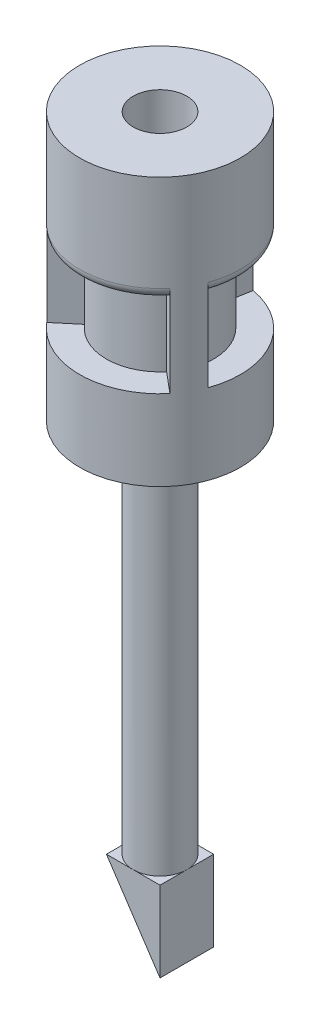
ISO-10303-21;
HEADER;
FILE_DESCRIPTION(('STEP AP214'),'2;1');
FILE_NAME('part.step','',(''),(''),'','','');
FILE_SCHEMA(('AUTOMOTIVE_DESIGN { 1 0 10303 214 1 1 1 1 }'));
ENDSEC;
DATA;
#1=APPLICATION_CONTEXT('core data for automotive mechanical design processes');
#2=APPLICATION_PROTOCOL_DEFINITION('international standard','automotive_design',2000,#1);
#3=PRODUCT_CONTEXT('',#1,'mechanical');
#4=PRODUCT('Part','Part','',(#3));
#5=PRODUCT_RELATED_PRODUCT_CATEGORY('part','',(#4));
#6=PRODUCT_DEFINITION_FORMATION('','',#4);
#7=PRODUCT_DEFINITION_CONTEXT('part definition',#1,'design');
#8=PRODUCT_DEFINITION('design','',#6,#7);
#9=PRODUCT_DEFINITION_SHAPE('','',#8);
#10=(LENGTH_UNIT() NAMED_UNIT(*) SI_UNIT(.MILLI.,.METRE.));
#11=(NAMED_UNIT(*) PLANE_ANGLE_UNIT() SI_UNIT($,.RADIAN.));
#12=(NAMED_UNIT(*) SI_UNIT($,.STERADIAN.) SOLID_ANGLE_UNIT());
#13=UNCERTAINTY_MEASURE_WITH_UNIT(LENGTH_MEASURE(1.E-05),#10,'distance_accuracy_value','');
#14=(GEOMETRIC_REPRESENTATION_CONTEXT(3) GLOBAL_UNCERTAINTY_ASSIGNED_CONTEXT((#13)) GLOBAL_UNIT_ASSIGNED_CONTEXT((#10,
#11,#12)) REPRESENTATION_CONTEXT('',''));
#15=CARTESIAN_POINT('',(0.,0.,0.));
#16=DIRECTION('',(0.,0.,1.));
#17=DIRECTION('',(1.,0.,0.));
#18=AXIS2_PLACEMENT_3D('',#15,#16,#17);
#19=CARTESIAN_POINT('',(10.,100.,0.));
#20=DIRECTION('',(0.,1.,0.));
#21=DIRECTION('',(0.,0.,1.));
#22=AXIS2_PLACEMENT_3D('',#19,#20,#21);
#23=PLANE('',#22);
#24=CARTESIAN_POINT('',(-5.,100.,0.));
#25=DIRECTION('',(0.,-1.,0.));
#26=DIRECTION('',(0.,0.,-1.));
#27=AXIS2_PLACEMENT_3D('',#24,#25,#26);
#28=CIRCLE('',#27,15.);
#29=CARTESIAN_POINT('',(-19.0953893117886,100.,5.13030214988503));
#30=VERTEX_POINT('',#29);
#31=CARTESIAN_POINT('',(-7.60472266500396,100.,-14.7721162951831));
#32=VERTEX_POINT('',#31);
#33=EDGE_CURVE('E193',#30,#32,#28,.T.);
#34=ORIENTED_EDGE('',*,*,#33,.F.);
#35=DIRECTION('',(-0.939692620785908,0.,0.342020143325669));
#36=VECTOR('',#35,1.);
#37=CARTESIAN_POINT('',(-12.0476946558945,100.,2.56515107494258));
#38=LINE('',#37,#36);
#39=CARTESIAN_POINT('',(-14.3969262078591,100.,3.42020143325669));
#40=VERTEX_POINT('',#39);
#41=EDGE_CURVE('E177',#40,#30,#38,.T.);
#42=ORIENTED_EDGE('',*,*,#41,.F.);
#43=CARTESIAN_POINT('',(-5.,100.,0.));
#44=DIRECTION('',(0.,-1.,0.));
#45=DIRECTION('',(0.,0.,-1.));
#46=AXIS2_PLACEMENT_3D('',#43,#44,#45);
#47=CIRCLE('',#46,10.);
#48=CARTESIAN_POINT('',(-6.73648177666931,100.,-9.84807753012208));
#49=VERTEX_POINT('',#48);
#50=EDGE_CURVE('E314',#40,#49,#47,.T.);
#51=ORIENTED_EDGE('',*,*,#50,.T.);
#52=DIRECTION('',(0.173648177666931,0.,0.984807753012208));
#53=VECTOR('',#52,1.);
#54=CARTESIAN_POINT('',(-6.30236133250201,100.,-7.38605814759173));
#55=LINE('',#54,#53);
#56=EDGE_CURVE('E346',#32,#49,#55,.T.);
#57=ORIENTED_EDGE('',*,*,#56,.F.);
#58=EDGE_LOOP('',(#34,#42,#51,#57));
#59=FACE_BOUND('',#58,.T.);
#60=ADVANCED_FACE('F33',(#59),#23,.T.);
#61=CARTESIAN_POINT('',(2.66044443118978,100.,6.4278760968654));
#62=VERTEX_POINT('',#61);
#63=CARTESIAN_POINT('',(-12.6604444311898,100.,6.4278760968654));
#64=VERTEX_POINT('',#63);
#65=EDGE_CURVE('E186',#62,#64,#47,.T.);
#66=ORIENTED_EDGE('',*,*,#65,.T.);
#67=DIRECTION('',(0.766044443118977,0.,-0.64278760968654));
#68=VECTOR('',#67,1.);
#69=CARTESIAN_POINT('',(-10.7453333233925,100.,4.82090707264917));
#70=LINE('',#69,#68);
#71=CARTESIAN_POINT('',(-16.4906666467847,100.,9.64181414529811));
#72=VERTEX_POINT('',#71);
#73=EDGE_CURVE('E170',#72,#64,#70,.T.);
#74=ORIENTED_EDGE('',*,*,#73,.F.);
#75=CARTESIAN_POINT('',(6.49066664678467,100.,9.6418141452981));
#76=VERTEX_POINT('',#75);
#77=EDGE_CURVE('E184',#76,#72,#28,.T.);
#78=ORIENTED_EDGE('',*,*,#77,.F.);
#79=DIRECTION('',(0.766044443118978,0.,0.64278760968654));
#80=VECTOR('',#79,1.);
#81=CARTESIAN_POINT('',(0.745333323392472,100.,4.82090707264916));
#82=LINE('',#81,#80);
#83=EDGE_CURVE('E331',#62,#76,#82,.T.);
#84=ORIENTED_EDGE('',*,*,#83,.F.);
#85=EDGE_LOOP('',(#66,#74,#78,#84));
#86=FACE_BOUND('',#85,.T.);
#87=ADVANCED_FACE('F182',(#86),#23,.T.);
#88=CARTESIAN_POINT('',(-5.,85.,0.));
#89=DIRECTION('',(0.,-1.,0.));
#90=DIRECTION('',(0.,0.,-1.));
#91=AXIS2_PLACEMENT_3D('',#88,#89,#90);
#92=CYLINDRICAL_SURFACE('',#91,10.);
#93=ORIENTED_EDGE('',*,*,#50,.F.);
#94=DIRECTION('',(0.,-1.,0.));
#95=VECTOR('',#94,1.);
#96=CARTESIAN_POINT('',(-14.3969262078591,85.,3.42020143325669));
#97=LINE('',#96,#95);
#98=CARTESIAN_POINT('',(-14.3969262078591,115.,3.42020143325669));
#99=VERTEX_POINT('',#98);
#100=EDGE_CURVE('E281',#99,#40,#97,.T.);
#101=ORIENTED_EDGE('',*,*,#100,.F.);
#102=CARTESIAN_POINT('',(-5.,115.,0.));
#103=DIRECTION('',(0.,-1.,0.));
#104=DIRECTION('',(0.,0.,-1.));
#105=AXIS2_PLACEMENT_3D('',#102,#103,#104);
#106=CIRCLE('',#105,10.);
#107=CARTESIAN_POINT('',(-6.7364817766693,115.,-9.84807753012208));
#108=VERTEX_POINT('',#107);
#109=EDGE_CURVE('E279',#99,#108,#106,.T.);
#110=ORIENTED_EDGE('',*,*,#109,.T.);
#111=DIRECTION('',(0.,-1.,0.));
#112=VECTOR('',#111,1.);
#113=CARTESIAN_POINT('',(-6.73648177666931,85.,-9.84807753012208));
#114=LINE('',#113,#112);
#115=EDGE_CURVE('E292',#49,#108,#114,.F.);
#116=ORIENTED_EDGE('',*,*,#115,.F.);
#117=EDGE_LOOP('',(#93,#101,#110,#116));
#118=FACE_BOUND('',#117,.T.);
#119=ADVANCED_FACE('F323',(#118),#92,.T.);
#120=CARTESIAN_POINT('',(2.66044443118978,115.,6.4278760968654));
#121=VERTEX_POINT('',#120);
#122=CARTESIAN_POINT('',(-12.6604444311898,115.,6.4278760968654));
#123=VERTEX_POINT('',#122);
#124=EDGE_CURVE('E315',#121,#123,#106,.T.);
#125=ORIENTED_EDGE('',*,*,#124,.T.);
#126=DIRECTION('',(0.,-1.,0.));
#127=VECTOR('',#126,1.);
#128=CARTESIAN_POINT('',(-12.6604444311898,85.,6.4278760968654));
#129=LINE('',#128,#127);
#130=EDGE_CURVE('E327',#64,#123,#129,.F.);
#131=ORIENTED_EDGE('',*,*,#130,.F.);
#132=ORIENTED_EDGE('',*,*,#65,.F.);
#133=DIRECTION('',(0.,-1.,0.));
#134=VECTOR('',#133,1.);
#135=CARTESIAN_POINT('',(2.66044443118978,85.,6.4278760968654));
#136=LINE('',#135,#134);
#137=EDGE_CURVE('E341',#121,#62,#136,.T.);
#138=ORIENTED_EDGE('',*,*,#137,.F.);
#139=EDGE_LOOP('',(#125,#131,#132,#138));
#140=FACE_BOUND('',#139,.T.);
#141=ADVANCED_FACE('F397',(#140),#92,.T.);
#142=CARTESIAN_POINT('',(10.,115.,0.));
#143=DIRECTION('',(0.,-1.,0.));
#144=DIRECTION('',(0.,0.,-1.));
#145=AXIS2_PLACEMENT_3D('',#142,#143,#144);
#146=PLANE('',#145);
#147=DIRECTION('',(0.939692620785909,0.,-0.342020143325669));
#148=VECTOR('',#147,1.);
#149=CARTESIAN_POINT('',(-12.0476946558945,115.,2.56515107494258));
#150=LINE('',#149,#148);
#151=CARTESIAN_POINT('',(-17.2160040702168,115.,4.4462618632337));
#152=VERTEX_POINT('',#151);
#153=EDGE_CURVE('E268',#152,#99,#150,.T.);
#154=ORIENTED_EDGE('',*,*,#153,.F.);
#155=CARTESIAN_POINT('',(-5.,115.,0.));
#156=DIRECTION('',(0.,-1.,0.));
#157=DIRECTION('',(0.,0.,-1.));
#158=AXIS2_PLACEMENT_3D('',#155,#156,#157);
#159=CIRCLE('',#158,13.);
#160=CARTESIAN_POINT('',(-7.2574263096701,115.,-12.8025007891587));
#161=VERTEX_POINT('',#160);
#162=EDGE_CURVE('E250',#152,#161,#159,.T.);
#163=ORIENTED_EDGE('',*,*,#162,.T.);
#164=DIRECTION('',(-0.173648177666931,0.,-0.984807753012208));
#165=VECTOR('',#164,1.);
#166=CARTESIAN_POINT('',(-6.30236133250201,115.,-7.38605814759173));
#167=LINE('',#166,#165);
#168=EDGE_CURVE('E290',#108,#161,#167,.T.);
#169=ORIENTED_EDGE('',*,*,#168,.F.);
#170=ORIENTED_EDGE('',*,*,#109,.F.);
#171=EDGE_LOOP('',(#154,#163,#169,#170));
#172=FACE_BOUND('',#171,.T.);
#173=ADVANCED_FACE('F276',(#172),#146,.T.);
#174=DIRECTION('',(-0.766044443118978,0.,-0.64278760968654));
#175=VECTOR('',#174,1.);
#176=CARTESIAN_POINT('',(0.745333323392474,115.,4.82090707264916));
#177=LINE('',#176,#175);
#178=CARTESIAN_POINT('',(4.95857776054672,115.,8.35623892592502));
#179=VERTEX_POINT('',#178);
#180=EDGE_CURVE('E344',#179,#121,#177,.T.);
#181=ORIENTED_EDGE('',*,*,#180,.F.);
#182=CARTESIAN_POINT('',(-5.,115.,0.));
#183=DIRECTION('',(0.,-1.,0.));
#184=DIRECTION('',(0.,0.,-1.));
#185=AXIS2_PLACEMENT_3D('',#182,#183,#184);
#186=CIRCLE('',#185,13.);
#187=CARTESIAN_POINT('',(-14.9585777605467,115.,8.35623892592503));
#188=VERTEX_POINT('',#187);
#189=EDGE_CURVE('E253',#179,#188,#186,.T.);
#190=ORIENTED_EDGE('',*,*,#189,.T.);
#191=DIRECTION('',(-0.766044443118977,0.,0.64278760968654));
#192=VECTOR('',#191,1.);
#193=CARTESIAN_POINT('',(-10.7453333233925,115.,4.82090707264917));
#194=LINE('',#193,#192);
#195=EDGE_CURVE('E325',#123,#188,#194,.T.);
#196=ORIENTED_EDGE('',*,*,#195,.F.);
#197=ORIENTED_EDGE('',*,*,#124,.F.);
#198=EDGE_LOOP('',(#181,#190,#196,#197));
#199=FACE_BOUND('',#198,.T.);
#200=ADVANCED_FACE('F392',(#199),#146,.T.);
#201=CARTESIAN_POINT('',(-3.26351822333069,100.,-9.84807753012208));
#202=VERTEX_POINT('',#201);
#203=CARTESIAN_POINT('',(4.39692620785909,100.,3.42020143325668));
#204=VERTEX_POINT('',#203);
#205=EDGE_CURVE('E197',#202,#204,#47,.T.);
#206=ORIENTED_EDGE('',*,*,#205,.T.);
#207=DIRECTION('',(-0.939692620785909,0.,-0.342020143325668));
#208=VECTOR('',#207,1.);
#209=CARTESIAN_POINT('',(2.04769465589448,100.,2.56515107494257));
#210=LINE('',#209,#208);
#211=CARTESIAN_POINT('',(9.09538931178864,100.,5.13030214988502));
#212=VERTEX_POINT('',#211);
#213=EDGE_CURVE('E280',#212,#204,#210,.T.);
#214=ORIENTED_EDGE('',*,*,#213,.F.);
#215=CARTESIAN_POINT('',(-2.39527733499603,100.,-14.7721162951831));
#216=VERTEX_POINT('',#215);
#217=EDGE_CURVE('E192',#216,#212,#28,.T.);
#218=ORIENTED_EDGE('',*,*,#217,.F.);
#219=DIRECTION('',(0.173648177666931,0.,-0.984807753012208));
#220=VECTOR('',#219,1.);
#221=CARTESIAN_POINT('',(-3.69763866749799,100.,-7.38605814759173));
#222=LINE('',#221,#220);
#223=EDGE_CURVE('E347',#202,#216,#222,.T.);
#224=ORIENTED_EDGE('',*,*,#223,.F.);
#225=EDGE_LOOP('',(#206,#214,#218,#224));
#226=FACE_BOUND('',#225,.T.);
#227=ADVANCED_FACE('F359',(#226),#23,.T.);
#228=CARTESIAN_POINT('',(-3.26351822333069,115.,-9.84807753012208));
#229=VERTEX_POINT('',#228);
#230=CARTESIAN_POINT('',(4.39692620785909,115.,3.42020143325668));
#231=VERTEX_POINT('',#230);
#232=EDGE_CURVE('E312',#229,#231,#106,.T.);
#233=ORIENTED_EDGE('',*,*,#232,.T.);
#234=DIRECTION('',(0.,-1.,0.));
#235=VECTOR('',#234,1.);
#236=CARTESIAN_POINT('',(4.39692620785909,85.,3.42020143325668));
#237=LINE('',#236,#235);
#238=EDGE_CURVE('E336',#204,#231,#237,.F.);
#239=ORIENTED_EDGE('',*,*,#238,.F.);
#240=ORIENTED_EDGE('',*,*,#205,.F.);
#241=DIRECTION('',(0.,-1.,0.));
#242=VECTOR('',#241,1.);
#243=CARTESIAN_POINT('',(-3.26351822333069,85.,-9.84807753012208));
#244=LINE('',#243,#242);
#245=EDGE_CURVE('E293',#229,#202,#244,.T.);
#246=ORIENTED_EDGE('',*,*,#245,.F.);
#247=EDGE_LOOP('',(#233,#239,#240,#246));
#248=FACE_BOUND('',#247,.T.);
#249=ADVANCED_FACE('F361',(#248),#92,.T.);
#250=DIRECTION('',(-0.173648177666931,0.,0.984807753012208));
#251=VECTOR('',#250,1.);
#252=CARTESIAN_POINT('',(-3.69763866749799,115.,-7.38605814759173));
#253=LINE('',#252,#251);
#254=CARTESIAN_POINT('',(-2.7425736903299,115.,-12.8025007891587));
#255=VERTEX_POINT('',#254);
#256=EDGE_CURVE('E296',#255,#229,#253,.T.);
#257=ORIENTED_EDGE('',*,*,#256,.F.);
#258=CARTESIAN_POINT('',(-5.,115.,0.));
#259=DIRECTION('',(0.,-1.,0.));
#260=DIRECTION('',(0.,0.,-1.));
#261=AXIS2_PLACEMENT_3D('',#258,#259,#260);
#262=CIRCLE('',#261,13.);
#263=CARTESIAN_POINT('',(7.21600407021681,115.,4.44626186323369));
#264=VERTEX_POINT('',#263);
#265=EDGE_CURVE('E239',#255,#264,#262,.T.);
#266=ORIENTED_EDGE('',*,*,#265,.T.);
#267=DIRECTION('',(0.939692620785909,0.,0.342020143325668));
#268=VECTOR('',#267,1.);
#269=CARTESIAN_POINT('',(2.04769465589448,115.,2.56515107494257));
#270=LINE('',#269,#268);
#271=EDGE_CURVE('E338',#231,#264,#270,.T.);
#272=ORIENTED_EDGE('',*,*,#271,.F.);
#273=ORIENTED_EDGE('',*,*,#232,.F.);
#274=EDGE_LOOP('',(#257,#266,#272,#273));
#275=FACE_BOUND('',#274,.T.);
#276=ADVANCED_FACE('F367',(#275),#146,.T.);
#277=CARTESIAN_POINT('',(-10.,15.,5.));
#278=DIRECTION('',(0.,-1.,0.));
#279=DIRECTION('',(0.,0.,-1.));
#280=AXIS2_PLACEMENT_3D('',#277,#278,#279);
#281=PLANE('',#280);
#282=DIRECTION('',(-1.,0.,0.));
#283=VECTOR('',#282,1.);
#284=CARTESIAN_POINT('',(-10.,15.,-5.));
#285=LINE('',#284,#283);
#286=CARTESIAN_POINT('',(0.,15.,-5.));
#287=VERTEX_POINT('',#286);
#288=CARTESIAN_POINT('',(-5.,15.,-5.));
#289=VERTEX_POINT('',#288);
#290=EDGE_CURVE('E221',#287,#289,#285,.T.);
#291=ORIENTED_EDGE('',*,*,#290,.T.);
#292=CARTESIAN_POINT('',(-5.,15.,0.));
#293=DIRECTION('',(0.,-1.,0.));
#294=DIRECTION('',(0.,0.,-1.));
#295=AXIS2_PLACEMENT_3D('',#292,#293,#294);
#296=CIRCLE('',#295,5.);
#297=CARTESIAN_POINT('',(0.,15.,0.));
#298=VERTEX_POINT('',#297);
#299=EDGE_CURVE('E206',#289,#298,#296,.T.);
#300=ORIENTED_EDGE('',*,*,#299,.T.);
#301=DIRECTION('',(0.,0.,-1.));
#302=VECTOR('',#301,1.);
#303=CARTESIAN_POINT('',(0.,15.,5.));
#304=LINE('',#303,#302);
#305=EDGE_CURVE('E220',#298,#287,#304,.T.);
#306=ORIENTED_EDGE('',*,*,#305,.T.);
#307=EDGE_LOOP('',(#291,#300,#306));
#308=FACE_BOUND('',#307,.T.);
#309=ADVANCED_FACE('F405',(#308),#281,.F.);
#310=CARTESIAN_POINT('',(0.,15.,5.));
#311=VERTEX_POINT('',#310);
#312=EDGE_CURVE('E229',#311,#298,#304,.T.);
#313=ORIENTED_EDGE('',*,*,#312,.T.);
#314=CARTESIAN_POINT('',(-5.,15.,5.));
#315=VERTEX_POINT('',#314);
#316=EDGE_CURVE('E210',#298,#315,#296,.T.);
#317=ORIENTED_EDGE('',*,*,#316,.T.);
#318=DIRECTION('',(-1.,0.,0.));
#319=VECTOR('',#318,1.);
#320=CARTESIAN_POINT('',(-10.,15.,5.));
#321=LINE('',#320,#319);
#322=EDGE_CURVE('E212',#311,#315,#321,.T.);
#323=ORIENTED_EDGE('',*,*,#322,.F.);
#324=EDGE_LOOP('',(#313,#317,#323));
#325=FACE_BOUND('',#324,.T.);
#326=ADVANCED_FACE('F409',(#325),#281,.F.);
#327=CARTESIAN_POINT('',(-10.,15.,5.));
#328=VERTEX_POINT('',#327);
#329=EDGE_CURVE('E216',#315,#328,#321,.T.);
#330=ORIENTED_EDGE('',*,*,#329,.F.);
#331=CARTESIAN_POINT('',(-9.99999999999999,15.,0.));
#332=VERTEX_POINT('',#331);
#333=EDGE_CURVE('E438',#315,#332,#296,.T.);
#334=ORIENTED_EDGE('',*,*,#333,.T.);
#335=DIRECTION('',(0.,0.,-1.));
#336=VECTOR('',#335,1.);
#337=CARTESIAN_POINT('',(-10.,15.,5.));
#338=LINE('',#337,#336);
#339=EDGE_CURVE('E236',#328,#332,#338,.T.);
#340=ORIENTED_EDGE('',*,*,#339,.F.);
#341=EDGE_LOOP('',(#330,#334,#340));
#342=FACE_BOUND('',#341,.T.);
#343=ADVANCED_FACE('F415',(#342),#281,.F.);
#344=CARTESIAN_POINT('',(-10.,15.,-5.));
#345=VERTEX_POINT('',#344);
#346=EDGE_CURVE('E235',#332,#345,#338,.T.);
#347=ORIENTED_EDGE('',*,*,#346,.F.);
#348=EDGE_CURVE('E211',#332,#289,#296,.T.);
#349=ORIENTED_EDGE('',*,*,#348,.T.);
#350=EDGE_CURVE('E209',#289,#345,#285,.T.);
#351=ORIENTED_EDGE('',*,*,#350,.T.);
#352=EDGE_LOOP('',(#347,#349,#351));
#353=FACE_BOUND('',#352,.T.);
#354=ADVANCED_FACE('F411',(#353),#281,.F.);
#355=CARTESIAN_POINT('',(-10.,15.,5.));
#356=DIRECTION('',(0.832050294337844,0.554700196225229,0.));
#357=DIRECTION('',(-0.554700196225229,0.832050294337844,0.));
#358=AXIS2_PLACEMENT_3D('',#355,#356,#357);
#359=PLANE('',#358);
#360=DIRECTION('',(0.554700196225229,-0.832050294337844,0.));
#361=VECTOR('',#360,1.);
#362=CARTESIAN_POINT('',(-10.,15.,-5.));
#363=LINE('',#362,#361);
#364=CARTESIAN_POINT('',(0.,0.,-5.));
#365=VERTEX_POINT('',#364);
#366=EDGE_CURVE('E224',#345,#365,#363,.T.);
#367=ORIENTED_EDGE('',*,*,#366,.T.);
#368=DIRECTION('',(0.,0.,-1.));
#369=VECTOR('',#368,1.);
#370=CARTESIAN_POINT('',(0.,0.,5.));
#371=LINE('',#370,#369);
#372=CARTESIAN_POINT('',(0.,0.,5.));
#373=VERTEX_POINT('',#372);
#374=EDGE_CURVE('E232',#373,#365,#371,.T.);
#375=ORIENTED_EDGE('',*,*,#374,.F.);
#376=DIRECTION('',(0.554700196225229,-0.832050294337844,0.));
#377=VECTOR('',#376,1.);
#378=CARTESIAN_POINT('',(-10.,15.,5.));
#379=LINE('',#378,#377);
#380=EDGE_CURVE('E215',#328,#373,#379,.T.);
#381=ORIENTED_EDGE('',*,*,#380,.F.);
#382=ORIENTED_EDGE('',*,*,#339,.T.);
#383=ORIENTED_EDGE('',*,*,#346,.T.);
#384=EDGE_LOOP('',(#367,#375,#381,#382,#383));
#385=FACE_BOUND('',#384,.T.);
#386=ADVANCED_FACE('F419',(#385),#359,.F.);
#387=CARTESIAN_POINT('',(0.,0.,5.));
#388=DIRECTION('',(-1.,0.,0.));
#389=DIRECTION('',(0.,-1.,0.));
#390=AXIS2_PLACEMENT_3D('',#387,#388,#389);
#391=PLANE('',#390);
#392=DIRECTION('',(0.,1.,0.));
#393=VECTOR('',#392,1.);
#394=CARTESIAN_POINT('',(0.,0.,-5.));
#395=LINE('',#394,#393);
#396=EDGE_CURVE('E226',#365,#287,#395,.T.);
#397=ORIENTED_EDGE('',*,*,#396,.T.);
#398=ORIENTED_EDGE('',*,*,#305,.F.);
#399=ORIENTED_EDGE('',*,*,#312,.F.);
#400=DIRECTION('',(0.,1.,0.));
#401=VECTOR('',#400,1.);
#402=CARTESIAN_POINT('',(0.,0.,5.));
#403=LINE('',#402,#401);
#404=EDGE_CURVE('E218',#373,#311,#403,.T.);
#405=ORIENTED_EDGE('',*,*,#404,.F.);
#406=ORIENTED_EDGE('',*,*,#374,.T.);
#407=EDGE_LOOP('',(#397,#398,#399,#405,#406));
#408=FACE_BOUND('',#407,.T.);
#409=ADVANCED_FACE('F425',(#408),#391,.F.);
#410=CARTESIAN_POINT('',(0.,0.,5.));
#411=DIRECTION('',(0.,0.,1.));
#412=DIRECTION('',(1.,0.,0.));
#413=AXIS2_PLACEMENT_3D('',#410,#411,#412);
#414=PLANE('',#413);
#415=ORIENTED_EDGE('',*,*,#322,.T.);
#416=ORIENTED_EDGE('',*,*,#329,.T.);
#417=ORIENTED_EDGE('',*,*,#380,.T.);
#418=ORIENTED_EDGE('',*,*,#404,.T.);
#419=EDGE_LOOP('',(#415,#416,#417,#418));
#420=FACE_BOUND('',#419,.T.);
#421=ADVANCED_FACE('F452',(#420),#414,.T.);
#422=CARTESIAN_POINT('',(0.,0.,-5.));
#423=DIRECTION('',(0.,0.,1.));
#424=DIRECTION('',(1.,0.,0.));
#425=AXIS2_PLACEMENT_3D('',#422,#423,#424);
#426=PLANE('',#425);
#427=ORIENTED_EDGE('',*,*,#290,.F.);
#428=ORIENTED_EDGE('',*,*,#396,.F.);
#429=ORIENTED_EDGE('',*,*,#366,.F.);
#430=ORIENTED_EDGE('',*,*,#350,.F.);
#431=EDGE_LOOP('',(#427,#428,#429,#430));
#432=FACE_BOUND('',#431,.T.);
#433=ADVANCED_FACE('F450',(#432),#426,.F.);
#434=CARTESIAN_POINT('',(-5.,15.,0.));
#435=DIRECTION('',(0.,-1.,0.));
#436=DIRECTION('',(0.,0.,-1.));
#437=AXIS2_PLACEMENT_3D('',#434,#435,#436);
#438=CYLINDRICAL_SURFACE('',#437,5.);
#439=CARTESIAN_POINT('',(-5.,85.,0.));
#440=DIRECTION('',(0.,-1.,0.));
#441=DIRECTION('',(0.,0.,-1.));
#442=AXIS2_PLACEMENT_3D('',#439,#440,#441);
#443=CIRCLE('',#442,5.);
#444=CARTESIAN_POINT('',(-5.,85.,-5.));
#445=VERTEX_POINT('',#444);
#446=EDGE_CURVE('E203',#445,#445,#443,.T.);
#447=ORIENTED_EDGE('',*,*,#446,.T.);
#448=EDGE_LOOP('',(#447));
#449=FACE_BOUND('',#448,.T.);
#450=ORIENTED_EDGE('',*,*,#299,.F.);
#451=ORIENTED_EDGE('',*,*,#348,.F.);
#452=ORIENTED_EDGE('',*,*,#333,.F.);
#453=ORIENTED_EDGE('',*,*,#316,.F.);
#454=EDGE_LOOP('',(#450,#451,#452,#453));
#455=FACE_BOUND('',#454,.T.);
#456=ADVANCED_FACE('F443',(#449,#455),#438,.T.);
#457=CARTESIAN_POINT('',(-5.,85.,0.));
#458=DIRECTION('',(0.,-1.,0.));
#459=DIRECTION('',(0.,0.,-1.));
#460=AXIS2_PLACEMENT_3D('',#457,#458,#459);
#461=PLANE('',#460);
#462=ORIENTED_EDGE('',*,*,#446,.F.);
#463=EDGE_LOOP('',(#462));
#464=FACE_BOUND('',#463,.T.);
#465=CARTESIAN_POINT('',(-5.,85.,0.));
#466=DIRECTION('',(0.,-1.,0.));
#467=DIRECTION('',(0.,0.,-1.));
#468=AXIS2_PLACEMENT_3D('',#465,#466,#467);
#469=CIRCLE('',#468,15.);
#470=CARTESIAN_POINT('',(-5.,85.,-15.));
#471=VERTEX_POINT('',#470);
#472=EDGE_CURVE('E196',#471,#471,#469,.T.);
#473=ORIENTED_EDGE('',*,*,#472,.T.);
#474=EDGE_LOOP('',(#473));
#475=FACE_BOUND('',#474,.T.);
#476=ADVANCED_FACE('F464',(#464,#475),#461,.T.);
#477=CARTESIAN_POINT('',(-5.,85.,0.));
#478=DIRECTION('',(0.,-1.,0.));
#479=DIRECTION('',(0.,0.,-1.));
#480=AXIS2_PLACEMENT_3D('',#477,#478,#479);
#481=CYLINDRICAL_SURFACE('',#480,15.);
#482=DIRECTION('',(0.,-1.,0.));
#483=VECTOR('',#482,1.);
#484=CARTESIAN_POINT('',(-7.60472266500396,135.002,-14.7721162951831));
#485=LINE('',#484,#483);
#486=CARTESIAN_POINT('',(-7.60472266500396,117.,-14.7721162951831));
#487=VERTEX_POINT('',#486);
#488=EDGE_CURVE('E289',#487,#32,#485,.T.);
#489=ORIENTED_EDGE('',*,*,#488,.F.);
#490=CARTESIAN_POINT('',(-5.,117.,0.));
#491=DIRECTION('',(0.,-1.,0.));
#492=DIRECTION('',(0.,0.,-1.));
#493=AXIS2_PLACEMENT_3D('',#490,#491,#492);
#494=CIRCLE('',#493,15.);
#495=CARTESIAN_POINT('',(-19.0953893117886,117.,5.13030214988503));
#496=VERTEX_POINT('',#495);
#497=EDGE_CURVE('E244',#487,#496,#494,.F.);
#498=ORIENTED_EDGE('',*,*,#497,.T.);
#499=DIRECTION('',(0.,-1.,0.));
#500=VECTOR('',#499,1.);
#501=CARTESIAN_POINT('',(-19.0953893117886,135.002,5.13030214988503));
#502=LINE('',#501,#500);
#503=EDGE_CURVE('E176',#496,#30,#502,.T.);
#504=ORIENTED_EDGE('',*,*,#503,.T.);
#505=ORIENTED_EDGE('',*,*,#33,.T.);
#506=EDGE_LOOP('',(#489,#498,#504,#505));
#507=FACE_BOUND('',#506,.T.);
#508=DIRECTION('',(0.,-1.,0.));
#509=VECTOR('',#508,1.);
#510=CARTESIAN_POINT('',(-16.4906666467847,135.002,9.64181414529811));
#511=LINE('',#510,#509);
#512=CARTESIAN_POINT('',(-16.4906666467847,117.,9.6418141452981));
#513=VERTEX_POINT('',#512);
#514=EDGE_CURVE('E167',#513,#72,#511,.T.);
#515=ORIENTED_EDGE('',*,*,#514,.F.);
#516=CARTESIAN_POINT('',(-5.,117.,0.));
#517=DIRECTION('',(0.,-1.,0.));
#518=DIRECTION('',(0.,0.,-1.));
#519=AXIS2_PLACEMENT_3D('',#516,#517,#518);
#520=CIRCLE('',#519,15.);
#521=CARTESIAN_POINT('',(6.49066664678467,117.,9.6418141452981));
#522=VERTEX_POINT('',#521);
#523=EDGE_CURVE('E242',#513,#522,#520,.F.);
#524=ORIENTED_EDGE('',*,*,#523,.T.);
#525=DIRECTION('',(0.,-1.,0.));
#526=VECTOR('',#525,1.);
#527=CARTESIAN_POINT('',(6.49066664678468,135.002,9.6418141452981));
#528=LINE('',#527,#526);
#529=EDGE_CURVE('E191',#522,#76,#528,.T.);
#530=ORIENTED_EDGE('',*,*,#529,.T.);
#531=ORIENTED_EDGE('',*,*,#77,.T.);
#532=EDGE_LOOP('',(#515,#524,#530,#531));
#533=FACE_BOUND('',#532,.T.);
#534=DIRECTION('',(0.,-1.,0.));
#535=VECTOR('',#534,1.);
#536=CARTESIAN_POINT('',(9.09538931178864,135.002,5.13030214988502));
#537=LINE('',#536,#535);
#538=CARTESIAN_POINT('',(9.09538931178863,117.,5.13030214988502));
#539=VERTEX_POINT('',#538);
#540=EDGE_CURVE('E333',#539,#212,#537,.T.);
#541=ORIENTED_EDGE('',*,*,#540,.F.);
#542=CARTESIAN_POINT('',(-5.,117.,0.));
#543=DIRECTION('',(0.,-1.,0.));
#544=DIRECTION('',(0.,0.,-1.));
#545=AXIS2_PLACEMENT_3D('',#542,#543,#544);
#546=CIRCLE('',#545,15.);
#547=CARTESIAN_POINT('',(-2.39527733499603,117.,-14.7721162951831));
#548=VERTEX_POINT('',#547);
#549=EDGE_CURVE('E247',#539,#548,#546,.F.);
#550=ORIENTED_EDGE('',*,*,#549,.T.);
#551=DIRECTION('',(0.,-1.,0.));
#552=VECTOR('',#551,1.);
#553=CARTESIAN_POINT('',(-2.39527733499603,135.002,-14.7721162951831));
#554=LINE('',#553,#552);
#555=EDGE_CURVE('E298',#548,#216,#554,.T.);
#556=ORIENTED_EDGE('',*,*,#555,.T.);
#557=ORIENTED_EDGE('',*,*,#217,.T.);
#558=EDGE_LOOP('',(#541,#550,#556,#557));
#559=FACE_BOUND('',#558,.T.);
#560=ORIENTED_EDGE('',*,*,#472,.F.);
#561=EDGE_LOOP('',(#560));
#562=FACE_BOUND('',#561,.T.);
#563=CARTESIAN_POINT('',(-5.,135.,0.));
#564=DIRECTION('',(0.,-1.,0.));
#565=DIRECTION('',(0.,0.,-1.));
#566=AXIS2_PLACEMENT_3D('',#563,#564,#565);
#567=CIRCLE('',#566,15.);
#568=CARTESIAN_POINT('',(-5.,135.,-15.));
#569=VERTEX_POINT('',#568);
#570=EDGE_CURVE('E310',#569,#569,#567,.T.);
#571=ORIENTED_EDGE('',*,*,#570,.T.);
#572=EDGE_LOOP('',(#571));
#573=FACE_BOUND('',#572,.T.);
#574=ADVANCED_FACE('F189',(#507,#533,#559,#562,#573),#481,.T.);
#575=CARTESIAN_POINT('',(10.,135.,0.));
#576=DIRECTION('',(0.,1.,0.));
#577=DIRECTION('',(0.,0.,1.));
#578=AXIS2_PLACEMENT_3D('',#575,#576,#577);
#579=PLANE('',#578);
#580=CARTESIAN_POINT('',(-5.,135.,0.));
#581=DIRECTION('',(0.,-1.,0.));
#582=DIRECTION('',(0.,0.,-1.));
#583=AXIS2_PLACEMENT_3D('',#580,#581,#582);
#584=CIRCLE('',#583,5.);
#585=CARTESIAN_POINT('',(-5.,135.,-5.));
#586=VERTEX_POINT('',#585);
#587=EDGE_CURVE('E307',#586,#586,#584,.T.);
#588=ORIENTED_EDGE('',*,*,#587,.T.);
#589=EDGE_LOOP('',(#588));
#590=FACE_BOUND('',#589,.T.);
#591=ORIENTED_EDGE('',*,*,#570,.F.);
#592=EDGE_LOOP('',(#591));
#593=FACE_BOUND('',#592,.T.);
#594=ADVANCED_FACE('F469',(#590,#593),#579,.T.);
#595=CARTESIAN_POINT('',(-5.,85.,0.));
#596=DIRECTION('',(0.,-1.,0.));
#597=DIRECTION('',(0.,0.,-1.));
#598=AXIS2_PLACEMENT_3D('',#595,#596,#597);
#599=CYLINDRICAL_SURFACE('',#598,5.);
#600=CARTESIAN_POINT('',(-5.,95.,0.));
#601=DIRECTION('',(0.,-1.,0.));
#602=DIRECTION('',(0.,0.,-1.));
#603=AXIS2_PLACEMENT_3D('',#600,#601,#602);
#604=CIRCLE('',#603,5.00000000000001);
#605=CARTESIAN_POINT('',(-5.,95.,-5.00000000000001));
#606=VERTEX_POINT('',#605);
#607=EDGE_CURVE('E304',#606,#606,#604,.T.);
#608=ORIENTED_EDGE('',*,*,#607,.T.);
#609=EDGE_LOOP('',(#608));
#610=FACE_BOUND('',#609,.T.);
#611=ORIENTED_EDGE('',*,*,#587,.F.);
#612=EDGE_LOOP('',(#611));
#613=FACE_BOUND('',#612,.T.);
#614=ADVANCED_FACE('F474',(#610,#613),#599,.F.);
#615=CARTESIAN_POINT('',(-5.,95.,0.));
#616=DIRECTION('',(0.,1.,0.));
#617=DIRECTION('',(0.,0.,1.));
#618=AXIS2_PLACEMENT_3D('',#615,#616,#617);
#619=PLANE('',#618);
#620=ORIENTED_EDGE('',*,*,#607,.F.);
#621=EDGE_LOOP('',(#620));
#622=FACE_BOUND('',#621,.T.);
#623=ADVANCED_FACE('F532',(#622),#619,.T.);
#624=CARTESIAN_POINT('',(-3.69763866749799,135.002,-7.38605814759173));
#625=DIRECTION('',(-0.984807753012208,0.,-0.173648177666931));
#626=DIRECTION('',(-0.173648177666931,0.,0.984807753012208));
#627=AXIS2_PLACEMENT_3D('',#624,#625,#626);
#628=PLANE('',#627);
#629=ORIENTED_EDGE('',*,*,#555,.F.);
#630=CARTESIAN_POINT('',(-2.7425736903299,117.,-12.8025007891587));
#631=DIRECTION('',(-0.984807753012208,0.,-0.173648177666931));
#632=DIRECTION('',(-0.173648177666931,0.,0.984807753012208));
#633=AXIS2_PLACEMENT_3D('',#630,#631,#632);
#634=CIRCLE('',#633,2.);
#635=EDGE_CURVE('E258',#548,#255,#634,.T.);
#636=ORIENTED_EDGE('',*,*,#635,.T.);
#637=ORIENTED_EDGE('',*,*,#256,.T.);
#638=ORIENTED_EDGE('',*,*,#245,.T.);
#639=ORIENTED_EDGE('',*,*,#223,.T.);
#640=EDGE_LOOP('',(#629,#636,#637,#638,#639));
#641=FACE_BOUND('',#640,.T.);
#642=ADVANCED_FACE('F355',(#641),#628,.F.);
#643=CARTESIAN_POINT('',(-6.30236133250201,135.002,-7.38605814759173));
#644=DIRECTION('',(0.984807753012208,0.,-0.173648177666931));
#645=DIRECTION('',(-0.173648177666931,0.,-0.984807753012208));
#646=AXIS2_PLACEMENT_3D('',#643,#644,#645);
#647=PLANE('',#646);
#648=ORIENTED_EDGE('',*,*,#115,.T.);
#649=ORIENTED_EDGE('',*,*,#168,.T.);
#650=CARTESIAN_POINT('',(-7.2574263096701,117.,-12.8025007891587));
#651=DIRECTION('',(0.984807753012208,0.,-0.173648177666931));
#652=DIRECTION('',(-0.173648177666931,0.,-0.984807753012208));
#653=AXIS2_PLACEMENT_3D('',#650,#651,#652);
#654=CIRCLE('',#653,2.);
#655=EDGE_CURVE('E260',#161,#487,#654,.T.);
#656=ORIENTED_EDGE('',*,*,#655,.T.);
#657=ORIENTED_EDGE('',*,*,#488,.T.);
#658=ORIENTED_EDGE('',*,*,#56,.T.);
#659=EDGE_LOOP('',(#648,#649,#656,#657,#658));
#660=FACE_BOUND('',#659,.T.);
#661=ADVANCED_FACE('F287',(#660),#647,.F.);
#662=CARTESIAN_POINT('',(0.745333323392475,135.002,4.82090707264916));
#663=DIRECTION('',(0.642787609686539,0.,-0.766044443118978));
#664=DIRECTION('',(-0.766044443118978,0.,-0.64278760968654));
#665=AXIS2_PLACEMENT_3D('',#662,#663,#664);
#666=PLANE('',#665);
#667=ORIENTED_EDGE('',*,*,#529,.F.);
#668=CARTESIAN_POINT('',(4.95857776054672,117.,8.35623892592502));
#669=DIRECTION('',(0.642787609686539,0.,-0.766044443118978));
#670=DIRECTION('',(-0.766044443118978,0.,-0.64278760968654));
#671=AXIS2_PLACEMENT_3D('',#668,#669,#670);
#672=CIRCLE('',#671,2.);
#673=EDGE_CURVE('E11',#522,#179,#672,.T.);
#674=ORIENTED_EDGE('',*,*,#673,.T.);
#675=ORIENTED_EDGE('',*,*,#180,.T.);
#676=ORIENTED_EDGE('',*,*,#137,.T.);
#677=ORIENTED_EDGE('',*,*,#83,.T.);
#678=EDGE_LOOP('',(#667,#674,#675,#676,#677));
#679=FACE_BOUND('',#678,.T.);
#680=ADVANCED_FACE('F378',(#679),#666,.F.);
#681=CARTESIAN_POINT('',(2.04769465589448,135.002,2.56515107494257));
#682=DIRECTION('',(-0.342020143325668,0.,0.939692620785909));
#683=DIRECTION('',(0.939692620785909,0.,0.342020143325668));
#684=AXIS2_PLACEMENT_3D('',#681,#682,#683);
#685=PLANE('',#684);
#686=ORIENTED_EDGE('',*,*,#238,.T.);
#687=ORIENTED_EDGE('',*,*,#271,.T.);
#688=CARTESIAN_POINT('',(7.21600407021682,117.,4.44626186323368));
#689=DIRECTION('',(-0.342020143325668,0.,0.939692620785909));
#690=DIRECTION('',(0.939692620785909,0.,0.342020143325668));
#691=AXIS2_PLACEMENT_3D('',#688,#689,#690);
#692=CIRCLE('',#691,2.);
#693=EDGE_CURVE('E255',#264,#539,#692,.T.);
#694=ORIENTED_EDGE('',*,*,#693,.T.);
#695=ORIENTED_EDGE('',*,*,#540,.T.);
#696=ORIENTED_EDGE('',*,*,#213,.T.);
#697=EDGE_LOOP('',(#686,#687,#694,#695,#696));
#698=FACE_BOUND('',#697,.T.);
#699=ADVANCED_FACE('F364',(#698),#685,.F.);
#700=CARTESIAN_POINT('',(-12.0476946558945,135.002,2.56515107494258));
#701=DIRECTION('',(0.342020143325669,0.,0.939692620785908));
#702=DIRECTION('',(0.939692620785909,0.,-0.342020143325669));
#703=AXIS2_PLACEMENT_3D('',#700,#701,#702);
#704=PLANE('',#703);
#705=ORIENTED_EDGE('',*,*,#503,.F.);
#706=CARTESIAN_POINT('',(-17.2160040702168,117.,4.44626186323369));
#707=DIRECTION('',(0.342020143325669,0.,0.939692620785908));
#708=DIRECTION('',(0.939692620785909,0.,-0.342020143325669));
#709=AXIS2_PLACEMENT_3D('',#706,#707,#708);
#710=CIRCLE('',#709,2.);
#711=EDGE_CURVE('E263',#496,#152,#710,.T.);
#712=ORIENTED_EDGE('',*,*,#711,.T.);
#713=ORIENTED_EDGE('',*,*,#153,.T.);
#714=ORIENTED_EDGE('',*,*,#100,.T.);
#715=ORIENTED_EDGE('',*,*,#41,.T.);
#716=EDGE_LOOP('',(#705,#712,#713,#714,#715));
#717=FACE_BOUND('',#716,.T.);
#718=ADVANCED_FACE('F267',(#717),#704,.F.);
#719=CARTESIAN_POINT('',(-10.7453333233925,135.002,4.82090707264917));
#720=DIRECTION('',(-0.64278760968654,0.,-0.766044443118977));
#721=DIRECTION('',(-0.766044443118977,0.,0.64278760968654));
#722=AXIS2_PLACEMENT_3D('',#719,#720,#721);
#723=PLANE('',#722);
#724=ORIENTED_EDGE('',*,*,#130,.T.);
#725=ORIENTED_EDGE('',*,*,#195,.T.);
#726=CARTESIAN_POINT('',(-14.9585777605467,117.,8.35623892592502));
#727=DIRECTION('',(-0.64278760968654,0.,-0.766044443118977));
#728=DIRECTION('',(-0.766044443118977,0.,0.64278760968654));
#729=AXIS2_PLACEMENT_3D('',#726,#727,#728);
#730=CIRCLE('',#729,2.);
#731=EDGE_CURVE('E41',#188,#513,#730,.T.);
#732=ORIENTED_EDGE('',*,*,#731,.T.);
#733=ORIENTED_EDGE('',*,*,#514,.T.);
#734=ORIENTED_EDGE('',*,*,#73,.T.);
#735=EDGE_LOOP('',(#724,#725,#732,#733,#734));
#736=FACE_BOUND('',#735,.T.);
#737=ADVANCED_FACE('F169',(#736),#723,.F.);
#738=CARTESIAN_POINT('',(-5.,117.,0.));
#739=DIRECTION('',(0.,-1.,0.));
#740=DIRECTION('',(0.,0.,-1.));
#741=AXIS2_PLACEMENT_3D('',#738,#739,#740);
#742=TOROIDAL_SURFACE('',#741,13.,2.);
#743=ORIENTED_EDGE('',*,*,#635,.F.);
#744=ORIENTED_EDGE('',*,*,#549,.F.);
#745=ORIENTED_EDGE('',*,*,#693,.F.);
#746=ORIENTED_EDGE('',*,*,#265,.F.);
#747=EDGE_LOOP('',(#743,#744,#745,#746));
#748=FACE_BOUND('',#747,.T.);
#749=ADVANCED_FACE('F370',(#748),#742,.T.);
#750=CARTESIAN_POINT('',(-5.,117.,0.));
#751=DIRECTION('',(0.,-1.,0.));
#752=DIRECTION('',(0.,0.,-1.));
#753=AXIS2_PLACEMENT_3D('',#750,#751,#752);
#754=TOROIDAL_SURFACE('',#753,13.,2.);
#755=ORIENTED_EDGE('',*,*,#711,.F.);
#756=ORIENTED_EDGE('',*,*,#497,.F.);
#757=ORIENTED_EDGE('',*,*,#655,.F.);
#758=ORIENTED_EDGE('',*,*,#162,.F.);
#759=EDGE_LOOP('',(#755,#756,#757,#758));
#760=FACE_BOUND('',#759,.T.);
#761=ADVANCED_FACE('F283',(#760),#754,.T.);
#762=CARTESIAN_POINT('',(-5.,117.,0.));
#763=DIRECTION('',(0.,-1.,0.));
#764=DIRECTION('',(0.,0.,-1.));
#765=AXIS2_PLACEMENT_3D('',#762,#763,#764);
#766=TOROIDAL_SURFACE('',#765,13.,2.);
#767=ORIENTED_EDGE('',*,*,#673,.F.);
#768=ORIENTED_EDGE('',*,*,#523,.F.);
#769=ORIENTED_EDGE('',*,*,#731,.F.);
#770=ORIENTED_EDGE('',*,*,#189,.F.);
#771=EDGE_LOOP('',(#767,#768,#769,#770));
#772=FACE_BOUND('',#771,.T.);
#773=ADVANCED_FACE('F35',(#772),#766,.T.);
#774=CLOSED_SHELL('',(#60,#87,#119,#141,#173,#200,#227,#249,#276,#309,#326,#343,#354,#386,#409,
#421,#433,#456,#476,#574,#594,#614,#623,#642,#661,#680,#699,#718,#737,#749,#761,#773));
#775=MANIFOLD_SOLID_BREP('B2',#774);
#776=ADVANCED_BREP_SHAPE_REPRESENTATION('',(#18,#775),#14);
#777=SHAPE_DEFINITION_REPRESENTATION(#9,#776);
ENDSEC;
END-ISO-10303-21;
